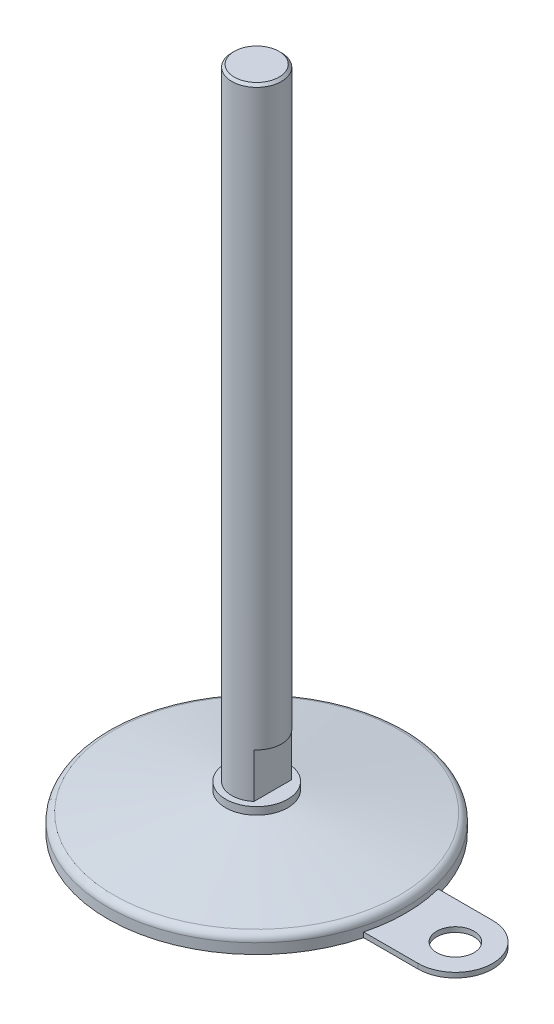
ISO-10303-21;
HEADER;
FILE_DESCRIPTION(('STEP AP214'),'2;1');
FILE_NAME('part.step','',(''),(''),'','','');
FILE_SCHEMA(('AUTOMOTIVE_DESIGN { 1 0 10303 214 1 1 1 1 }'));
ENDSEC;
DATA;
#1=APPLICATION_CONTEXT('core data for automotive mechanical design processes');
#2=APPLICATION_PROTOCOL_DEFINITION('international standard','automotive_design',2000,#1);
#3=PRODUCT_CONTEXT('',#1,'mechanical');
#4=PRODUCT('Part','Part','',(#3));
#5=PRODUCT_RELATED_PRODUCT_CATEGORY('part','',(#4));
#6=PRODUCT_DEFINITION_FORMATION('','',#4);
#7=PRODUCT_DEFINITION_CONTEXT('part definition',#1,'design');
#8=PRODUCT_DEFINITION('design','',#6,#7);
#9=PRODUCT_DEFINITION_SHAPE('','',#8);
#10=(LENGTH_UNIT() NAMED_UNIT(*) SI_UNIT(.MILLI.,.METRE.));
#11=(NAMED_UNIT(*) PLANE_ANGLE_UNIT() SI_UNIT($,.RADIAN.));
#12=(NAMED_UNIT(*) SI_UNIT($,.STERADIAN.) SOLID_ANGLE_UNIT());
#13=UNCERTAINTY_MEASURE_WITH_UNIT(LENGTH_MEASURE(1.E-05),#10,'distance_accuracy_value','');
#14=(GEOMETRIC_REPRESENTATION_CONTEXT(3) GLOBAL_UNCERTAINTY_ASSIGNED_CONTEXT((#13)) GLOBAL_UNIT_ASSIGNED_CONTEXT((#10,
#11,#12)) REPRESENTATION_CONTEXT('',''));
#15=CARTESIAN_POINT('',(0.,0.,0.));
#16=DIRECTION('',(0.,0.,1.));
#17=DIRECTION('',(1.,0.,0.));
#18=AXIS2_PLACEMENT_3D('',#15,#16,#17);
#19=CARTESIAN_POINT('',(0.,0.,0.));
#20=DIRECTION('',(0.,-1.,0.));
#21=DIRECTION('',(1.,0.,0.));
#22=AXIS2_PLACEMENT_3D('',#19,#20,#21);
#23=PLANE('',#22);
#24=CARTESIAN_POINT('',(0.,0.,0.));
#25=DIRECTION('',(0.,1.,0.));
#26=DIRECTION('',(-1.,0.,0.));
#27=AXIS2_PLACEMENT_3D('',#24,#25,#26);
#28=CIRCLE('',#27,55.);
#29=CARTESIAN_POINT('',(-55.,0.,0.));
#30=VERTEX_POINT('',#29);
#31=EDGE_CURVE('E163',#30,#30,#28,.T.);
#32=ORIENTED_EDGE('',*,*,#31,.F.);
#33=EDGE_LOOP('',(#32));
#34=FACE_BOUND('',#33,.T.);
#35=ADVANCED_FACE('F36',(#34),#23,.T.);
#36=CARTESIAN_POINT('',(0.,290.,0.));
#37=DIRECTION('',(0.,1.,0.));
#38=DIRECTION('',(-1.,0.,0.));
#39=AXIS2_PLACEMENT_3D('',#36,#37,#38);
#40=CYLINDRICAL_SURFACE('',#39,55.);
#41=ORIENTED_EDGE('',*,*,#31,.T.);
#42=EDGE_LOOP('',(#41));
#43=FACE_BOUND('',#42,.T.);
#44=CARTESIAN_POINT('',(0.,2.,0.));
#45=DIRECTION('',(0.,1.,0.));
#46=DIRECTION('',(-1.,0.,0.));
#47=AXIS2_PLACEMENT_3D('',#44,#45,#46);
#48=CIRCLE('',#47,55.);
#49=CARTESIAN_POINT('',(-55.,2.,0.));
#50=VERTEX_POINT('',#49);
#51=EDGE_CURVE('E160',#50,#50,#48,.T.);
#52=ORIENTED_EDGE('',*,*,#51,.F.);
#53=EDGE_LOOP('',(#52));
#54=FACE_BOUND('',#53,.T.);
#55=ADVANCED_FACE('F219',(#43,#54),#40,.T.);
#56=CARTESIAN_POINT('',(-60.,2.,0.));
#57=DIRECTION('',(0.,-1.,0.));
#58=DIRECTION('',(1.,0.,0.));
#59=AXIS2_PLACEMENT_3D('',#56,#57,#58);
#60=PLANE('',#59);
#61=ORIENTED_EDGE('',*,*,#51,.T.);
#62=EDGE_LOOP('',(#61));
#63=FACE_BOUND('',#62,.T.);
#64=DIRECTION('',(-1.,0.,0.));
#65=VECTOR('',#64,1.);
#66=CARTESIAN_POINT('',(0.,2.,15.));
#67=LINE('',#66,#65);
#68=CARTESIAN_POINT('',(80.,2.00000000000001,15.));
#69=VERTEX_POINT('',#68);
#70=CARTESIAN_POINT('',(58.0947501931113,2.00000000000001,15.));
#71=VERTEX_POINT('',#70);
#72=EDGE_CURVE('E123',#69,#71,#67,.T.);
#73=ORIENTED_EDGE('',*,*,#72,.T.);
#74=CARTESIAN_POINT('',(0.,2.,0.));
#75=DIRECTION('',(0.,1.,0.));
#76=DIRECTION('',(-1.,0.,0.));
#77=AXIS2_PLACEMENT_3D('',#74,#75,#76);
#78=CIRCLE('',#77,60.);
#79=CARTESIAN_POINT('',(58.0947501931113,2.00000000000001,-15.));
#80=VERTEX_POINT('',#79);
#81=EDGE_CURVE('E158',#80,#71,#78,.T.);
#82=ORIENTED_EDGE('',*,*,#81,.F.);
#83=DIRECTION('',(1.,0.,0.));
#84=VECTOR('',#83,1.);
#85=CARTESIAN_POINT('',(0.,2.,-15.));
#86=LINE('',#85,#84);
#87=CARTESIAN_POINT('',(80.,2.00000000000001,-15.));
#88=VERTEX_POINT('',#87);
#89=EDGE_CURVE('E126',#80,#88,#86,.T.);
#90=ORIENTED_EDGE('',*,*,#89,.T.);
#91=CARTESIAN_POINT('',(80.,2.00000000000001,0.));
#92=DIRECTION('',(0.,-1.,0.));
#93=DIRECTION('',(1.,0.,0.));
#94=AXIS2_PLACEMENT_3D('',#91,#92,#93);
#95=CIRCLE('',#94,15.);
#96=EDGE_CURVE('E113',#88,#69,#95,.T.);
#97=ORIENTED_EDGE('',*,*,#96,.T.);
#98=EDGE_LOOP('',(#73,#82,#90,#97));
#99=FACE_BOUND('',#98,.T.);
#100=CARTESIAN_POINT('',(80.,2.00000000000001,0.));
#101=DIRECTION('',(0.,-1.,0.));
#102=DIRECTION('',(1.,0.,0.));
#103=AXIS2_PLACEMENT_3D('',#100,#101,#102);
#104=CIRCLE('',#103,7.50000000000001);
#105=CARTESIAN_POINT('',(87.5000000000001,2.00000000000001,0.));
#106=VERTEX_POINT('',#105);
#107=EDGE_CURVE('E388',#106,#106,#104,.T.);
#108=ORIENTED_EDGE('',*,*,#107,.F.);
#109=EDGE_LOOP('',(#108));
#110=FACE_BOUND('',#109,.T.);
#111=ADVANCED_FACE('F224',(#63,#99,#110),#60,.T.);
#112=CARTESIAN_POINT('',(0.,290.,0.));
#113=DIRECTION('',(0.,1.,0.));
#114=DIRECTION('',(-1.,0.,0.));
#115=AXIS2_PLACEMENT_3D('',#112,#113,#114);
#116=CYLINDRICAL_SURFACE('',#115,60.);
#117=DIRECTION('',(0.,1.,0.));
#118=VECTOR('',#117,1.);
#119=CARTESIAN_POINT('',(58.0947501931113,290.,15.));
#120=LINE('',#119,#118);
#121=CARTESIAN_POINT('',(58.0947501931113,4.00000000000001,15.));
#122=VERTEX_POINT('',#121);
#123=EDGE_CURVE('E11',#122,#71,#120,.F.);
#124=ORIENTED_EDGE('',*,*,#123,.F.);
#125=CARTESIAN_POINT('',(0.,4.,0.));
#126=DIRECTION('',(0.,-1.,0.));
#127=DIRECTION('',(1.,0.,0.));
#128=AXIS2_PLACEMENT_3D('',#125,#126,#127);
#129=CIRCLE('',#128,60.);
#130=CARTESIAN_POINT('',(58.0947501931113,4.00000000000001,-15.));
#131=VERTEX_POINT('',#130);
#132=EDGE_CURVE('E51',#122,#131,#129,.F.);
#133=ORIENTED_EDGE('',*,*,#132,.T.);
#134=DIRECTION('',(0.,1.,0.));
#135=VECTOR('',#134,1.);
#136=CARTESIAN_POINT('',(58.0947501931113,290.,-15.));
#137=LINE('',#136,#135);
#138=EDGE_CURVE('E44',#80,#131,#137,.T.);
#139=ORIENTED_EDGE('',*,*,#138,.F.);
#140=ORIENTED_EDGE('',*,*,#81,.T.);
#141=EDGE_LOOP('',(#124,#133,#139,#140));
#142=FACE_BOUND('',#141,.T.);
#143=CARTESIAN_POINT('',(0.,6.10716952281637,0.));
#144=DIRECTION('',(0.,1.,0.));
#145=DIRECTION('',(-1.,0.,0.));
#146=AXIS2_PLACEMENT_3D('',#143,#144,#145);
#147=CIRCLE('',#146,60.);
#148=CARTESIAN_POINT('',(-60.,6.10716952281636,0.));
#149=VERTEX_POINT('',#148);
#150=EDGE_CURVE('E155',#149,#149,#147,.T.);
#151=ORIENTED_EDGE('',*,*,#150,.F.);
#152=EDGE_LOOP('',(#151));
#153=FACE_BOUND('',#152,.T.);
#154=ADVANCED_FACE('F231',(#142,#153),#116,.T.);
#155=CARTESIAN_POINT('',(0.,6.1071695228164,0.));
#156=DIRECTION('',(0.,1.,0.));
#157=DIRECTION('',(-1.,0.,0.));
#158=AXIS2_PLACEMENT_3D('',#155,#156,#157);
#159=TOROIDAL_SURFACE('',#158,57.,3.);
#160=ORIENTED_EDGE('',*,*,#150,.T.);
#161=EDGE_LOOP('',(#160));
#162=FACE_BOUND('',#161,.T.);
#163=CARTESIAN_POINT('',(0.,9.06159278185303,0.));
#164=DIRECTION('',(0.,1.,0.));
#165=DIRECTION('',(-1.,0.,0.));
#166=AXIS2_PLACEMENT_3D('',#163,#164,#165);
#167=CIRCLE('',#166,57.5209445330008);
#168=CARTESIAN_POINT('',(57.5209445330008,9.06159278185304,0.));
#169=VERTEX_POINT('',#168);
#170=EDGE_CURVE('E152',#169,#169,#167,.T.);
#171=ORIENTED_EDGE('',*,*,#170,.F.);
#172=EDGE_LOOP('',(#171));
#173=FACE_BOUND('',#172,.T.);
#174=ADVANCED_FACE('F235',(#162,#173),#159,.T.);
#175=CARTESIAN_POINT('',(0.,17.,0.));
#176=DIRECTION('',(0.,-1.,0.));
#177=DIRECTION('',(1.,0.,0.));
#178=AXIS2_PLACEMENT_3D('',#175,#176,#177);
#179=CONICAL_SURFACE('',#178,12.5,1.39626340159547);
#180=CARTESIAN_POINT('',(0.,17.,0.));
#181=DIRECTION('',(0.,1.,0.));
#182=DIRECTION('',(-1.,0.,0.));
#183=AXIS2_PLACEMENT_3D('',#180,#181,#182);
#184=CIRCLE('',#183,12.5);
#185=CARTESIAN_POINT('',(12.5,17.,0.));
#186=VERTEX_POINT('',#185);
#187=EDGE_CURVE('E149',#186,#186,#184,.T.);
#188=CARTESIAN_POINT('',(57.5209445330008,9.06159278185304,0.));
#189=CARTESIAN_POINT('',(57.051976360782,9.14428452370874,0.));
#190=CARTESIAN_POINT('',(56.5830081885633,9.22697626556444,0.));
#191=CARTESIAN_POINT('',(55.6450718441258,9.39235974927583,0.));
#192=CARTESIAN_POINT('',(55.176103671907,9.47505149113153,0.));
#193=CARTESIAN_POINT('',(54.2381673274695,9.64043497484293,0.));
#194=CARTESIAN_POINT('',(53.7691991552507,9.72312671669862,0.));
#195=CARTESIAN_POINT('',(52.8312628108132,9.88851020041002,0.));
#196=CARTESIAN_POINT('',(52.3622946385945,9.97120194226571,0.));
#197=CARTESIAN_POINT('',(51.4243582941569,10.1365854259771,0.));
#198=CARTESIAN_POINT('',(50.9553901219382,10.2192771678328,0.));
#199=CARTESIAN_POINT('',(50.0174537775007,10.3846606515442,0.));
#200=CARTESIAN_POINT('',(49.5484856052819,10.4673523933999,0.));
#201=CARTESIAN_POINT('',(48.6105492608444,10.6327358771113,0.));
#202=CARTESIAN_POINT('',(48.1415810886256,10.715427618967,0.));
#203=CARTESIAN_POINT('',(47.2036447441881,10.8808111026784,0.));
#204=CARTESIAN_POINT('',(46.7346765719694,10.9635028445341,0.));
#205=CARTESIAN_POINT('',(45.7967402275318,11.1288863282455,0.));
#206=CARTESIAN_POINT('',(45.3277720553131,11.2115780701012,0.));
#207=CARTESIAN_POINT('',(44.3898357108756,11.3769615538126,0.));
#208=CARTESIAN_POINT('',(43.9208675386568,11.4596532956683,0.));
#209=CARTESIAN_POINT('',(42.9829311942193,11.6250367793797,0.));
#210=CARTESIAN_POINT('',(42.5139630220005,11.7077285212354,0.));
#211=CARTESIAN_POINT('',(41.576026677563,11.8731120049468,0.));
#212=CARTESIAN_POINT('',(41.1070585053443,11.9558037468025,0.));
#213=CARTESIAN_POINT('',(40.1691221609067,12.1211872305139,0.));
#214=CARTESIAN_POINT('',(39.700153988688,12.2038789723696,0.));
#215=CARTESIAN_POINT('',(38.7622176442505,12.3692624560809,0.));
#216=CARTESIAN_POINT('',(38.2932494720317,12.4519541979366,0.));
#217=CARTESIAN_POINT('',(37.3553131275942,12.617337681648,0.));
#218=CARTESIAN_POINT('',(36.8863449553754,12.7000294235037,0.));
#219=CARTESIAN_POINT('',(35.9484086109379,12.8654129072151,0.));
#220=CARTESIAN_POINT('',(35.4794404387192,12.9481046490708,0.));
#221=CARTESIAN_POINT('',(34.5415040942816,13.1134881327822,0.));
#222=CARTESIAN_POINT('',(34.0725359220629,13.1961798746379,0.));
#223=CARTESIAN_POINT('',(33.1345995776254,13.3615633583493,0.));
#224=CARTESIAN_POINT('',(32.6656314054066,13.444255100205,0.));
#225=CARTESIAN_POINT('',(31.7276950609691,13.6096385839164,0.));
#226=CARTESIAN_POINT('',(31.2587268887503,13.6923303257721,0.));
#227=CARTESIAN_POINT('',(30.3207905443128,13.8577138094835,0.));
#228=CARTESIAN_POINT('',(29.8518223720941,13.9404055513392,0.));
#229=CARTESIAN_POINT('',(28.9138860276566,14.1057890350506,0.));
#230=CARTESIAN_POINT('',(28.4449178554378,14.1884807769063,0.));
#231=CARTESIAN_POINT('',(27.5069815110003,14.3538642606177,0.));
#232=CARTESIAN_POINT('',(27.0380133387815,14.4365560024734,0.));
#233=CARTESIAN_POINT('',(26.100076994344,14.6019394861848,0.));
#234=CARTESIAN_POINT('',(25.6311088221252,14.6846312280405,0.));
#235=CARTESIAN_POINT('',(24.6931724776877,14.8500147117519,0.));
#236=CARTESIAN_POINT('',(24.224204305469,14.9327064536076,0.));
#237=CARTESIAN_POINT('',(23.2862679610315,15.098089937319,0.));
#238=CARTESIAN_POINT('',(22.8172997888127,15.1807816791747,0.));
#239=CARTESIAN_POINT('',(21.8793634443752,15.3461651628861,0.));
#240=CARTESIAN_POINT('',(21.4103952721564,15.4288569047418,0.));
#241=CARTESIAN_POINT('',(20.4724589277189,15.5942403884532,0.));
#242=CARTESIAN_POINT('',(20.0034907555001,15.6769321303089,0.));
#243=CARTESIAN_POINT('',(19.0655544110626,15.8423156140203,0.));
#244=CARTESIAN_POINT('',(18.5965862388439,15.925007355876,0.));
#245=CARTESIAN_POINT('',(17.6586498944064,16.0903908395873,0.));
#246=CARTESIAN_POINT('',(17.1896817221876,16.173082581443,0.));
#247=CARTESIAN_POINT('',(16.2517453777501,16.3384660651544,0.));
#248=CARTESIAN_POINT('',(15.7827772055313,16.4211578070101,0.));
#249=CARTESIAN_POINT('',(14.8448408610938,16.5865412907215,0.));
#250=CARTESIAN_POINT('',(14.3758726888751,16.6692330325772,0.));
#251=CARTESIAN_POINT('',(13.4379363444375,16.8346165162886,0.));
#252=CARTESIAN_POINT('',(12.9689681722188,16.9173082581443,0.));
#253=CARTESIAN_POINT('',(12.5,17.,0.));
#254=B_SPLINE_CURVE_WITH_KNOTS('',3,(#188,#189,#190,#191,#192,#193,#194,#195,#196,#197,#198,
#199,#200,#201,#202,#203,#204,#205,#206,#207,#208,#209,#210,#211,#212,#213,#214,#215,#216,#217,
#218,#219,#220,#221,#222,#223,#224,#225,#226,#227,#228,#229,#230,#231,#232,#233,#234,#235,#236,
#237,#238,#239,#240,#241,#242,#243,#244,#245,#246,#247,#248,#249,#250,#251,#252,#253),
.UNSPECIFIED.,.F.,.F.,(4,2,2,2,2,2,2,2,2,2,2,2,2,2,2,2,2,2,2,2,2,2,2,2,2,2,2,2,2,2,2,2,4),(0.,
1.42860828659503,2.85721657319006,4.28582485978509,5.71443314638012,7.14304143297515,
8.57164971957018,10.0002580061652,11.4288662927602,12.8574745793553,14.2860828659503,
15.7146911525453,17.1432994391404,18.5719077257354,20.0005160123304,21.4291242989255,
22.8577325855205,24.2863408721155,25.7149491587105,27.1435574453056,28.5721657319006,
30.0007740184956,31.4293823050907,32.8579905916857,34.2865988782807,35.7152071648758,
37.1438154514708,38.5724237380658,40.0010320246609,41.4296403112559,42.8582485978509,
44.2868568844459,45.715465171041),.UNSPECIFIED.);
#255=EDGE_CURVE('BSEAM238',#169,#186,#254,.T.);
#256=ORIENTED_EDGE('',*,*,#170,.T.);
#257=ORIENTED_EDGE('',*,*,#187,.F.);
#258=ORIENTED_EDGE('',*,*,#255,.T.);
#259=ORIENTED_EDGE('',*,*,#255,.F.);
#260=EDGE_LOOP('',(#256,#258,#257,#259));
#261=FACE_BOUND('',#260,.T.);
#262=ADVANCED_FACE('F238',(#261),#179,.T.);
#263=CARTESIAN_POINT('',(0.,290.,0.));
#264=DIRECTION('',(0.,1.,0.));
#265=DIRECTION('',(-1.,0.,0.));
#266=AXIS2_PLACEMENT_3D('',#263,#264,#265);
#267=CYLINDRICAL_SURFACE('',#266,12.5);
#268=ORIENTED_EDGE('',*,*,#187,.T.);
#269=EDGE_LOOP('',(#268));
#270=FACE_BOUND('',#269,.T.);
#271=CARTESIAN_POINT('',(0.,20.,0.));
#272=DIRECTION('',(0.,1.,0.));
#273=DIRECTION('',(-1.,0.,0.));
#274=AXIS2_PLACEMENT_3D('',#271,#272,#273);
#275=CIRCLE('',#274,12.5);
#276=CARTESIAN_POINT('',(-12.5,20.,0.));
#277=VERTEX_POINT('',#276);
#278=EDGE_CURVE('E146',#277,#277,#275,.T.);
#279=ORIENTED_EDGE('',*,*,#278,.F.);
#280=EDGE_LOOP('',(#279));
#281=FACE_BOUND('',#280,.T.);
#282=ADVANCED_FACE('F242',(#270,#281),#267,.T.);
#283=CARTESIAN_POINT('',(-12.5,20.,0.));
#284=DIRECTION('',(0.,1.,0.));
#285=DIRECTION('',(-1.,0.,0.));
#286=AXIS2_PLACEMENT_3D('',#283,#284,#285);
#287=PLANE('',#286);
#288=CARTESIAN_POINT('',(0.,20.,0.));
#289=DIRECTION('',(0.,1.,0.));
#290=DIRECTION('',(-1.,0.,0.));
#291=AXIS2_PLACEMENT_3D('',#288,#289,#290);
#292=CIRCLE('',#291,10.);
#293=CARTESIAN_POINT('',(6.5,20.,-7.59934207678533));
#294=VERTEX_POINT('',#293);
#295=CARTESIAN_POINT('',(-6.5,20.,-7.59934207678529));
#296=VERTEX_POINT('',#295);
#297=EDGE_CURVE('E141',#294,#296,#292,.T.);
#298=ORIENTED_EDGE('',*,*,#297,.F.);
#299=DIRECTION('',(0.,0.,1.));
#300=VECTOR('',#299,1.);
#301=CARTESIAN_POINT('',(6.5,20.,-10.));
#302=LINE('',#301,#300);
#303=CARTESIAN_POINT('',(6.5,20.,7.59934207678533));
#304=VERTEX_POINT('',#303);
#305=EDGE_CURVE('E132',#294,#304,#302,.T.);
#306=ORIENTED_EDGE('',*,*,#305,.T.);
#307=CARTESIAN_POINT('',(-6.5,20.,7.59934207678529));
#308=VERTEX_POINT('',#307);
#309=EDGE_CURVE('E143',#308,#304,#292,.T.);
#310=ORIENTED_EDGE('',*,*,#309,.F.);
#311=DIRECTION('',(0.,0.,1.));
#312=VECTOR('',#311,1.);
#313=CARTESIAN_POINT('',(-6.5,20.,-10.));
#314=LINE('',#313,#312);
#315=EDGE_CURVE('E135',#296,#308,#314,.T.);
#316=ORIENTED_EDGE('',*,*,#315,.F.);
#317=EDGE_LOOP('',(#298,#306,#310,#316));
#318=FACE_BOUND('',#317,.T.);
#319=ORIENTED_EDGE('',*,*,#278,.T.);
#320=EDGE_LOOP('',(#319));
#321=FACE_BOUND('',#320,.T.);
#322=ADVANCED_FACE('F195',(#318,#321),#287,.T.);
#323=CARTESIAN_POINT('',(0.,290.,0.));
#324=DIRECTION('',(0.,1.,0.));
#325=DIRECTION('',(-1.,0.,0.));
#326=AXIS2_PLACEMENT_3D('',#323,#324,#325);
#327=CYLINDRICAL_SURFACE('',#326,9.99999999999998);
#328=DIRECTION('',(0.,1.,0.));
#329=VECTOR('',#328,1.);
#330=CARTESIAN_POINT('',(6.49999999999997,290.,7.59934207678533));
#331=LINE('',#330,#329);
#332=CARTESIAN_POINT('',(6.5,38.,7.59934207678534));
#333=VERTEX_POINT('',#332);
#334=EDGE_CURVE('E184',#333,#304,#331,.F.);
#335=ORIENTED_EDGE('',*,*,#334,.F.);
#336=CARTESIAN_POINT('',(0.,38.,0.));
#337=DIRECTION('',(0.,1.,0.));
#338=DIRECTION('',(0.,0.,1.));
#339=AXIS2_PLACEMENT_3D('',#336,#337,#338);
#340=CIRCLE('',#339,9.99999999999998);
#341=CARTESIAN_POINT('',(6.5,38.,-7.59934207678534));
#342=VERTEX_POINT('',#341);
#343=EDGE_CURVE('E179',#342,#333,#340,.F.);
#344=ORIENTED_EDGE('',*,*,#343,.F.);
#345=DIRECTION('',(0.,1.,0.));
#346=VECTOR('',#345,1.);
#347=CARTESIAN_POINT('',(6.49999999999997,290.,-7.59934207678533));
#348=LINE('',#347,#346);
#349=EDGE_CURVE('E181',#294,#342,#348,.T.);
#350=ORIENTED_EDGE('',*,*,#349,.F.);
#351=ORIENTED_EDGE('',*,*,#297,.T.);
#352=DIRECTION('',(0.,1.,0.));
#353=VECTOR('',#352,1.);
#354=CARTESIAN_POINT('',(-6.50000000000004,290.,-7.59934207678528));
#355=LINE('',#354,#353);
#356=CARTESIAN_POINT('',(-6.5,38.,-7.59934207678528));
#357=VERTEX_POINT('',#356);
#358=EDGE_CURVE('E176',#357,#296,#355,.F.);
#359=ORIENTED_EDGE('',*,*,#358,.F.);
#360=CARTESIAN_POINT('',(0.,38.,0.));
#361=DIRECTION('',(0.,1.,0.));
#362=DIRECTION('',(0.,0.,1.));
#363=AXIS2_PLACEMENT_3D('',#360,#361,#362);
#364=CIRCLE('',#363,9.99999999999998);
#365=CARTESIAN_POINT('',(-6.5,38.,7.59934207678528));
#366=VERTEX_POINT('',#365);
#367=EDGE_CURVE('E174',#366,#357,#364,.F.);
#368=ORIENTED_EDGE('',*,*,#367,.F.);
#369=DIRECTION('',(0.,1.,0.));
#370=VECTOR('',#369,1.);
#371=CARTESIAN_POINT('',(-6.50000000000004,290.,7.59934207678528));
#372=LINE('',#371,#370);
#373=EDGE_CURVE('E172',#308,#366,#372,.T.);
#374=ORIENTED_EDGE('',*,*,#373,.F.);
#375=ORIENTED_EDGE('',*,*,#309,.T.);
#376=EDGE_LOOP('',(#335,#344,#350,#351,#359,#368,#374,#375));
#377=FACE_BOUND('',#376,.T.);
#378=CARTESIAN_POINT('',(0.,269.,0.));
#379=DIRECTION('',(0.,1.,0.));
#380=DIRECTION('',(-1.,0.,0.));
#381=AXIS2_PLACEMENT_3D('',#378,#379,#380);
#382=CIRCLE('',#381,9.99999999999998);
#383=CARTESIAN_POINT('',(-9.99999999999998,269.,0.));
#384=VERTEX_POINT('',#383);
#385=EDGE_CURVE('E169',#384,#384,#382,.F.);
#386=ORIENTED_EDGE('',*,*,#385,.T.);
#387=EDGE_LOOP('',(#386));
#388=FACE_BOUND('',#387,.T.);
#389=ADVANCED_FACE('F199',(#377,#388),#327,.T.);
#390=CARTESIAN_POINT('',(-9.99999999999997,270.,0.));
#391=DIRECTION('',(0.,1.,0.));
#392=DIRECTION('',(-1.,0.,0.));
#393=AXIS2_PLACEMENT_3D('',#390,#391,#392);
#394=PLANE('',#393);
#395=CARTESIAN_POINT('',(0.,270.,0.));
#396=DIRECTION('',(0.,1.,0.));
#397=DIRECTION('',(-1.,0.,0.));
#398=AXIS2_PLACEMENT_3D('',#395,#396,#397);
#399=CIRCLE('',#398,8.99999999999996);
#400=CARTESIAN_POINT('',(-8.99999999999996,270.,0.));
#401=VERTEX_POINT('',#400);
#402=EDGE_CURVE('E166',#401,#401,#399,.T.);
#403=ORIENTED_EDGE('',*,*,#402,.T.);
#404=EDGE_LOOP('',(#403));
#405=FACE_BOUND('',#404,.T.);
#406=ADVANCED_FACE('F215',(#405),#394,.T.);
#407=CARTESIAN_POINT('',(0.,270.,0.));
#408=DIRECTION('',(0.,-1.,0.));
#409=DIRECTION('',(1.,0.,0.));
#410=AXIS2_PLACEMENT_3D('',#407,#408,#409);
#411=CONICAL_SURFACE('',#410,8.99999999999996,0.78539816339746);
#412=ORIENTED_EDGE('',*,*,#385,.F.);
#413=EDGE_LOOP('',(#412));
#414=FACE_BOUND('',#413,.T.);
#415=ORIENTED_EDGE('',*,*,#402,.F.);
#416=EDGE_LOOP('',(#415));
#417=FACE_BOUND('',#416,.T.);
#418=ADVANCED_FACE('F38',(#414,#417),#411,.T.);
#419=CARTESIAN_POINT('',(-9.99999999999998,38.,-10.));
#420=DIRECTION('',(0.,1.,0.));
#421=DIRECTION('',(0.,0.,1.));
#422=AXIS2_PLACEMENT_3D('',#419,#420,#421);
#423=PLANE('',#422);
#424=ORIENTED_EDGE('',*,*,#367,.T.);
#425=DIRECTION('',(0.,0.,1.));
#426=VECTOR('',#425,1.);
#427=CARTESIAN_POINT('',(-6.5,38.,-10.));
#428=LINE('',#427,#426);
#429=EDGE_CURVE('E138',#357,#366,#428,.T.);
#430=ORIENTED_EDGE('',*,*,#429,.T.);
#431=EDGE_LOOP('',(#424,#430));
#432=FACE_BOUND('',#431,.T.);
#433=ADVANCED_FACE('F207',(#432),#423,.F.);
#434=CARTESIAN_POINT('',(-6.5,38.,-10.));
#435=DIRECTION('',(1.,0.,0.));
#436=DIRECTION('',(0.,1.,0.));
#437=AXIS2_PLACEMENT_3D('',#434,#435,#436);
#438=PLANE('',#437);
#439=ORIENTED_EDGE('',*,*,#358,.T.);
#440=ORIENTED_EDGE('',*,*,#315,.T.);
#441=ORIENTED_EDGE('',*,*,#373,.T.);
#442=ORIENTED_EDGE('',*,*,#429,.F.);
#443=EDGE_LOOP('',(#439,#440,#441,#442));
#444=FACE_BOUND('',#443,.T.);
#445=ADVANCED_FACE('F205',(#444),#438,.F.);
#446=CARTESIAN_POINT('',(6.5,38.,-10.));
#447=DIRECTION('',(-1.,0.,0.));
#448=DIRECTION('',(0.,-1.,0.));
#449=AXIS2_PLACEMENT_3D('',#446,#447,#448);
#450=PLANE('',#449);
#451=ORIENTED_EDGE('',*,*,#334,.T.);
#452=ORIENTED_EDGE('',*,*,#305,.F.);
#453=ORIENTED_EDGE('',*,*,#349,.T.);
#454=DIRECTION('',(0.,0.,1.));
#455=VECTOR('',#454,1.);
#456=CARTESIAN_POINT('',(6.5,38.,-10.));
#457=LINE('',#456,#455);
#458=EDGE_CURVE('E130',#342,#333,#457,.T.);
#459=ORIENTED_EDGE('',*,*,#458,.T.);
#460=EDGE_LOOP('',(#451,#452,#453,#459));
#461=FACE_BOUND('',#460,.T.);
#462=ADVANCED_FACE('F188',(#461),#450,.F.);
#463=CARTESIAN_POINT('',(10.,38.,-10.));
#464=DIRECTION('',(0.,1.,0.));
#465=DIRECTION('',(0.,0.,1.));
#466=AXIS2_PLACEMENT_3D('',#463,#464,#465);
#467=PLANE('',#466);
#468=ORIENTED_EDGE('',*,*,#458,.F.);
#469=ORIENTED_EDGE('',*,*,#343,.T.);
#470=EDGE_LOOP('',(#468,#469));
#471=FACE_BOUND('',#470,.T.);
#472=ADVANCED_FACE('F306',(#471),#467,.F.);
#473=CARTESIAN_POINT('',(0.,4.,15.));
#474=DIRECTION('',(0.,0.,1.));
#475=DIRECTION('',(1.,0.,0.));
#476=AXIS2_PLACEMENT_3D('',#473,#474,#475);
#477=PLANE('',#476);
#478=DIRECTION('',(-1.,0.,0.));
#479=VECTOR('',#478,1.);
#480=CARTESIAN_POINT('',(0.,4.,15.));
#481=LINE('',#480,#479);
#482=CARTESIAN_POINT('',(80.,4.00000000000001,15.));
#483=VERTEX_POINT('',#482);
#484=EDGE_CURVE('E107',#483,#122,#481,.T.);
#485=ORIENTED_EDGE('',*,*,#484,.T.);
#486=ORIENTED_EDGE('',*,*,#123,.T.);
#487=ORIENTED_EDGE('',*,*,#72,.F.);
#488=DIRECTION('',(0.,-1.,0.));
#489=VECTOR('',#488,1.);
#490=CARTESIAN_POINT('',(80.,4.00000000000001,15.));
#491=LINE('',#490,#489);
#492=EDGE_CURVE('E114',#483,#69,#491,.T.);
#493=ORIENTED_EDGE('',*,*,#492,.F.);
#494=EDGE_LOOP('',(#485,#486,#487,#493));
#495=FACE_BOUND('',#494,.T.);
#496=ADVANCED_FACE('F315',(#495),#477,.T.);
#497=CARTESIAN_POINT('',(80.,4.00000000000001,0.));
#498=DIRECTION('',(0.,-1.,0.));
#499=DIRECTION('',(1.,0.,0.));
#500=AXIS2_PLACEMENT_3D('',#497,#498,#499);
#501=CYLINDRICAL_SURFACE('',#500,15.);
#502=ORIENTED_EDGE('',*,*,#96,.F.);
#503=DIRECTION('',(0.,-1.,0.));
#504=VECTOR('',#503,1.);
#505=CARTESIAN_POINT('',(80.,4.00000000000001,-15.));
#506=LINE('',#505,#504);
#507=CARTESIAN_POINT('',(80.,4.00000000000001,-15.));
#508=VERTEX_POINT('',#507);
#509=EDGE_CURVE('E102',#508,#88,#506,.T.);
#510=ORIENTED_EDGE('',*,*,#509,.F.);
#511=CARTESIAN_POINT('',(80.,4.00000000000001,0.));
#512=DIRECTION('',(0.,-1.,0.));
#513=DIRECTION('',(1.,0.,0.));
#514=AXIS2_PLACEMENT_3D('',#511,#512,#513);
#515=CIRCLE('',#514,15.);
#516=EDGE_CURVE('E106',#508,#483,#515,.T.);
#517=ORIENTED_EDGE('',*,*,#516,.T.);
#518=ORIENTED_EDGE('',*,*,#492,.T.);
#519=EDGE_LOOP('',(#502,#510,#517,#518));
#520=FACE_BOUND('',#519,.T.);
#521=ADVANCED_FACE('F111',(#520),#501,.T.);
#522=CARTESIAN_POINT('',(0.,4.,-15.));
#523=DIRECTION('',(0.,0.,-1.));
#524=DIRECTION('',(-1.,0.,0.));
#525=AXIS2_PLACEMENT_3D('',#522,#523,#524);
#526=PLANE('',#525);
#527=ORIENTED_EDGE('',*,*,#89,.F.);
#528=ORIENTED_EDGE('',*,*,#138,.T.);
#529=DIRECTION('',(1.,0.,0.));
#530=VECTOR('',#529,1.);
#531=CARTESIAN_POINT('',(0.,4.,-15.));
#532=LINE('',#531,#530);
#533=EDGE_CURVE('E98',#131,#508,#532,.T.);
#534=ORIENTED_EDGE('',*,*,#533,.T.);
#535=ORIENTED_EDGE('',*,*,#509,.T.);
#536=EDGE_LOOP('',(#527,#528,#534,#535));
#537=FACE_BOUND('',#536,.T.);
#538=ADVANCED_FACE('F101',(#537),#526,.T.);
#539=CARTESIAN_POINT('',(80.,4.00000000000001,0.));
#540=DIRECTION('',(0.,-1.,0.));
#541=DIRECTION('',(1.,0.,0.));
#542=AXIS2_PLACEMENT_3D('',#539,#540,#541);
#543=PLANE('',#542);
#544=ORIENTED_EDGE('',*,*,#132,.F.);
#545=ORIENTED_EDGE('',*,*,#484,.F.);
#546=ORIENTED_EDGE('',*,*,#516,.F.);
#547=ORIENTED_EDGE('',*,*,#533,.F.);
#548=EDGE_LOOP('',(#544,#545,#546,#547));
#549=FACE_BOUND('',#548,.T.);
#550=CARTESIAN_POINT('',(80.,4.00000000000001,0.));
#551=DIRECTION('',(0.,-1.,0.));
#552=DIRECTION('',(1.,0.,0.));
#553=AXIS2_PLACEMENT_3D('',#550,#551,#552);
#554=CIRCLE('',#553,7.50000000000001);
#555=CARTESIAN_POINT('',(87.5000000000001,4.00000000000002,0.));
#556=VERTEX_POINT('',#555);
#557=EDGE_CURVE('E127',#556,#556,#554,.T.);
#558=ORIENTED_EDGE('',*,*,#557,.T.);
#559=EDGE_LOOP('',(#558));
#560=FACE_BOUND('',#559,.T.);
#561=ADVANCED_FACE('F117',(#549,#560),#543,.F.);
#562=CARTESIAN_POINT('',(80.,4.00000000000001,0.));
#563=DIRECTION('',(0.,-1.,0.));
#564=DIRECTION('',(1.,0.,0.));
#565=AXIS2_PLACEMENT_3D('',#562,#563,#564);
#566=CYLINDRICAL_SURFACE('',#565,7.50000000000001);
#567=ORIENTED_EDGE('',*,*,#557,.F.);
#568=EDGE_LOOP('',(#567));
#569=FACE_BOUND('',#568,.T.);
#570=ORIENTED_EDGE('',*,*,#107,.T.);
#571=EDGE_LOOP('',(#570));
#572=FACE_BOUND('',#571,.T.);
#573=ADVANCED_FACE('F370',(#569,#572),#566,.F.);
#574=CLOSED_SHELL('',(#35,#55,#111,#154,#174,#262,#282,#322,#389,#406,#418,#433,#445,#462,#472,
#496,#521,#538,#561,#573));
#575=MANIFOLD_SOLID_BREP('B2',#574);
#576=ADVANCED_BREP_SHAPE_REPRESENTATION('',(#18,#575),#14);
#577=SHAPE_DEFINITION_REPRESENTATION(#9,#576);
ENDSEC;
END-ISO-10303-21;
